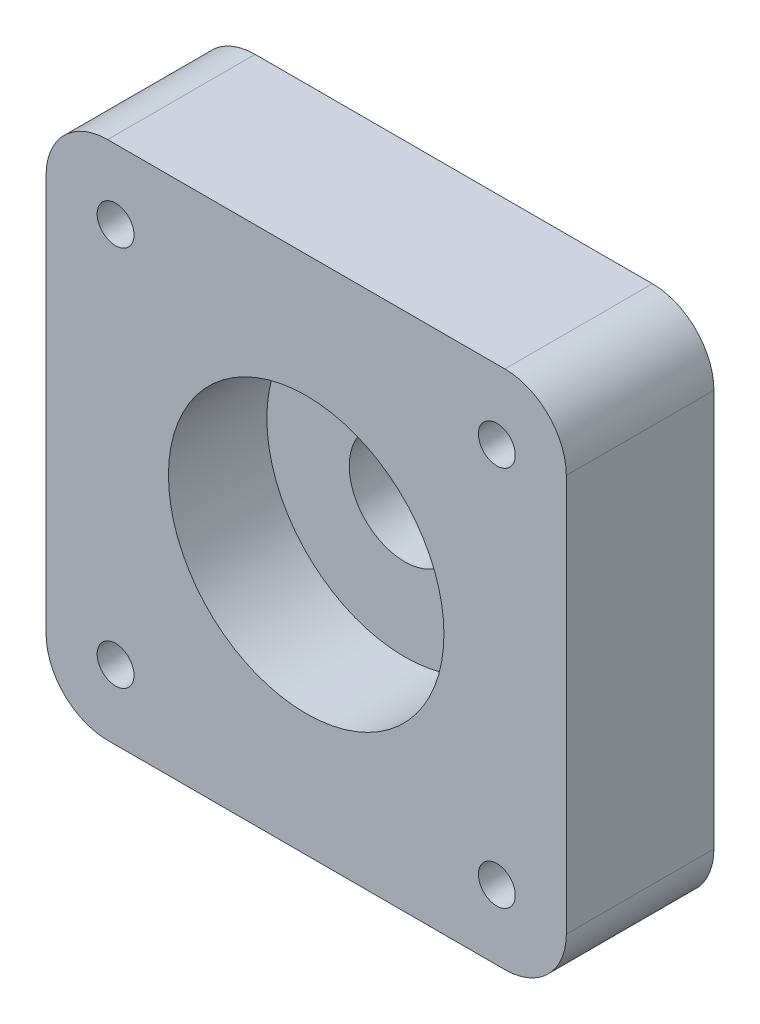
ISO-10303-21;
HEADER;
FILE_DESCRIPTION(('STEP AP214'),'2;1');
FILE_NAME('part.step','',(''),(''),'','','');
FILE_SCHEMA(('AUTOMOTIVE_DESIGN { 1 0 10303 214 1 1 1 1 }'));
ENDSEC;
DATA;
#1=APPLICATION_CONTEXT('core data for automotive mechanical design processes');
#2=APPLICATION_PROTOCOL_DEFINITION('international standard','automotive_design',2000,#1);
#3=PRODUCT_CONTEXT('',#1,'mechanical');
#4=PRODUCT('Part','Part','',(#3));
#5=PRODUCT_RELATED_PRODUCT_CATEGORY('part','',(#4));
#6=PRODUCT_DEFINITION_FORMATION('','',#4);
#7=PRODUCT_DEFINITION_CONTEXT('part definition',#1,'design');
#8=PRODUCT_DEFINITION('design','',#6,#7);
#9=PRODUCT_DEFINITION_SHAPE('','',#8);
#10=(LENGTH_UNIT() NAMED_UNIT(*) SI_UNIT(.MILLI.,.METRE.));
#11=(NAMED_UNIT(*) PLANE_ANGLE_UNIT() SI_UNIT($,.RADIAN.));
#12=(NAMED_UNIT(*) SI_UNIT($,.STERADIAN.) SOLID_ANGLE_UNIT());
#13=UNCERTAINTY_MEASURE_WITH_UNIT(LENGTH_MEASURE(1.E-05),#10,'distance_accuracy_value','');
#14=(GEOMETRIC_REPRESENTATION_CONTEXT(3) GLOBAL_UNCERTAINTY_ASSIGNED_CONTEXT((#13)) GLOBAL_UNIT_ASSIGNED_CONTEXT((#10,
#11,#12)) REPRESENTATION_CONTEXT('',''));
#15=CARTESIAN_POINT('',(0.,0.,0.));
#16=DIRECTION('',(0.,0.,1.));
#17=DIRECTION('',(1.,0.,0.));
#18=AXIS2_PLACEMENT_3D('',#15,#16,#17);
#19=CARTESIAN_POINT('',(0.,0.,6.));
#20=DIRECTION('',(0.,0.,-1.));
#21=DIRECTION('',(-1.,0.,0.));
#22=AXIS2_PLACEMENT_3D('',#19,#20,#21);
#23=PLANE('',#22);
#24=CARTESIAN_POINT('',(0.,0.,6.));
#25=DIRECTION('',(0.,0.,1.));
#26=DIRECTION('',(1.,0.,0.));
#27=AXIS2_PLACEMENT_3D('',#24,#25,#26);
#28=CIRCLE('',#27,11.2);
#29=CARTESIAN_POINT('',(11.2,0.,6.));
#30=VERTEX_POINT('',#29);
#31=EDGE_CURVE('E204',#30,#30,#28,.T.);
#32=ORIENTED_EDGE('',*,*,#31,.F.);
#33=EDGE_LOOP('',(#32));
#34=FACE_BOUND('',#33,.T.);
#35=DIRECTION('',(-1.,0.,0.));
#36=VECTOR('',#35,1.);
#37=CARTESIAN_POINT('',(-21.15,21.15,6.));
#38=LINE('',#37,#36);
#39=CARTESIAN_POINT('',(16.15,21.15,6.));
#40=VERTEX_POINT('',#39);
#41=CARTESIAN_POINT('',(-16.15,21.15,6.));
#42=VERTEX_POINT('',#41);
#43=EDGE_CURVE('E170',#40,#42,#38,.T.);
#44=ORIENTED_EDGE('',*,*,#43,.T.);
#45=CARTESIAN_POINT('',(-16.15,16.15,6.));
#46=DIRECTION('',(0.,0.,-1.));
#47=DIRECTION('',(-1.,0.,0.));
#48=AXIS2_PLACEMENT_3D('',#45,#46,#47);
#49=CIRCLE('',#48,5.);
#50=CARTESIAN_POINT('',(-21.15,16.15,6.));
#51=VERTEX_POINT('',#50);
#52=EDGE_CURVE('E150',#42,#51,#49,.F.);
#53=ORIENTED_EDGE('',*,*,#52,.T.);
#54=DIRECTION('',(0.,-1.,0.));
#55=VECTOR('',#54,1.);
#56=CARTESIAN_POINT('',(-21.15,-21.15,6.));
#57=LINE('',#56,#55);
#58=CARTESIAN_POINT('',(-21.15,-16.15,6.));
#59=VERTEX_POINT('',#58);
#60=EDGE_CURVE('E120',#51,#59,#57,.T.);
#61=ORIENTED_EDGE('',*,*,#60,.T.);
#62=CARTESIAN_POINT('',(-16.15,-16.15,6.));
#63=DIRECTION('',(0.,0.,-1.));
#64=DIRECTION('',(-1.,0.,0.));
#65=AXIS2_PLACEMENT_3D('',#62,#63,#64);
#66=CIRCLE('',#65,5.);
#67=CARTESIAN_POINT('',(-16.15,-21.15,6.));
#68=VERTEX_POINT('',#67);
#69=EDGE_CURVE('E56',#59,#68,#66,.F.);
#70=ORIENTED_EDGE('',*,*,#69,.T.);
#71=DIRECTION('',(1.,0.,0.));
#72=VECTOR('',#71,1.);
#73=CARTESIAN_POINT('',(-21.15,-21.15,6.));
#74=LINE('',#73,#72);
#75=CARTESIAN_POINT('',(16.15,-21.15,6.));
#76=VERTEX_POINT('',#75);
#77=EDGE_CURVE('E136',#68,#76,#74,.T.);
#78=ORIENTED_EDGE('',*,*,#77,.T.);
#79=CARTESIAN_POINT('',(16.15,-16.15,6.));
#80=DIRECTION('',(0.,0.,-1.));
#81=DIRECTION('',(-1.,0.,0.));
#82=AXIS2_PLACEMENT_3D('',#79,#80,#81);
#83=CIRCLE('',#82,5.);
#84=CARTESIAN_POINT('',(21.15,-16.15,6.));
#85=VERTEX_POINT('',#84);
#86=EDGE_CURVE('E147',#76,#85,#83,.F.);
#87=ORIENTED_EDGE('',*,*,#86,.T.);
#88=DIRECTION('',(0.,1.,0.));
#89=VECTOR('',#88,1.);
#90=CARTESIAN_POINT('',(21.15,-21.15,6.));
#91=LINE('',#90,#89);
#92=CARTESIAN_POINT('',(21.15,16.15,6.));
#93=VERTEX_POINT('',#92);
#94=EDGE_CURVE('E130',#85,#93,#91,.T.);
#95=ORIENTED_EDGE('',*,*,#94,.T.);
#96=CARTESIAN_POINT('',(16.15,16.15,6.));
#97=DIRECTION('',(0.,0.,-1.));
#98=DIRECTION('',(-1.,0.,0.));
#99=AXIS2_PLACEMENT_3D('',#96,#97,#98);
#100=CIRCLE('',#99,5.);
#101=EDGE_CURVE('E145',#93,#40,#100,.F.);
#102=ORIENTED_EDGE('',*,*,#101,.T.);
#103=EDGE_LOOP('',(#44,#53,#61,#70,#78,#87,#95,#102));
#104=FACE_BOUND('',#103,.T.);
#105=CARTESIAN_POINT('',(-15.5,15.5,6.));
#106=DIRECTION('',(0.,0.,1.));
#107=DIRECTION('',(1.,0.,0.));
#108=AXIS2_PLACEMENT_3D('',#105,#106,#107);
#109=CIRCLE('',#108,1.5);
#110=CARTESIAN_POINT('',(-14.,15.5,6.));
#111=VERTEX_POINT('',#110);
#112=EDGE_CURVE('E175',#111,#111,#109,.T.);
#113=ORIENTED_EDGE('',*,*,#112,.F.);
#114=EDGE_LOOP('',(#113));
#115=FACE_BOUND('',#114,.T.);
#116=CARTESIAN_POINT('',(-15.5,-15.5,6.));
#117=DIRECTION('',(0.,0.,1.));
#118=DIRECTION('',(1.,0.,0.));
#119=AXIS2_PLACEMENT_3D('',#116,#117,#118);
#120=CIRCLE('',#119,1.5);
#121=CARTESIAN_POINT('',(-14.,-15.5,6.));
#122=VERTEX_POINT('',#121);
#123=EDGE_CURVE('E184',#122,#122,#120,.T.);
#124=ORIENTED_EDGE('',*,*,#123,.F.);
#125=EDGE_LOOP('',(#124));
#126=FACE_BOUND('',#125,.T.);
#127=CARTESIAN_POINT('',(15.5,-15.5,6.));
#128=DIRECTION('',(0.,0.,1.));
#129=DIRECTION('',(-1.,0.,0.));
#130=AXIS2_PLACEMENT_3D('',#127,#128,#129);
#131=CIRCLE('',#130,1.5);
#132=CARTESIAN_POINT('',(14.,-15.5,6.));
#133=VERTEX_POINT('',#132);
#134=EDGE_CURVE('E189',#133,#133,#131,.T.);
#135=ORIENTED_EDGE('',*,*,#134,.F.);
#136=EDGE_LOOP('',(#135));
#137=FACE_BOUND('',#136,.T.);
#138=CARTESIAN_POINT('',(15.5,15.5,6.));
#139=DIRECTION('',(0.,0.,1.));
#140=DIRECTION('',(-1.,0.,0.));
#141=AXIS2_PLACEMENT_3D('',#138,#139,#140);
#142=CIRCLE('',#141,1.5);
#143=CARTESIAN_POINT('',(14.,15.5,6.));
#144=VERTEX_POINT('',#143);
#145=EDGE_CURVE('E195',#144,#144,#142,.T.);
#146=ORIENTED_EDGE('',*,*,#145,.F.);
#147=EDGE_LOOP('',(#146));
#148=FACE_BOUND('',#147,.T.);
#149=ADVANCED_FACE('F33',(#34,#104,#115,#126,#137,#148),#23,.F.);
#150=CARTESIAN_POINT('',(0.,0.,-6.));
#151=DIRECTION('',(0.,0.,-1.));
#152=DIRECTION('',(-1.,0.,0.));
#153=AXIS2_PLACEMENT_3D('',#150,#151,#152);
#154=PLANE('',#153);
#155=CARTESIAN_POINT('',(0.,0.,-6.));
#156=DIRECTION('',(0.,0.,-1.));
#157=DIRECTION('',(-1.,0.,0.));
#158=AXIS2_PLACEMENT_3D('',#155,#156,#157);
#159=CIRCLE('',#158,4.5);
#160=CARTESIAN_POINT('',(-4.5,0.,-6.));
#161=VERTEX_POINT('',#160);
#162=EDGE_CURVE('E209',#161,#161,#159,.T.);
#163=ORIENTED_EDGE('',*,*,#162,.F.);
#164=EDGE_LOOP('',(#163));
#165=FACE_BOUND('',#164,.T.);
#166=CARTESIAN_POINT('',(15.5,-15.5,-6.));
#167=DIRECTION('',(0.,0.,1.));
#168=DIRECTION('',(-1.,0.,0.));
#169=AXIS2_PLACEMENT_3D('',#166,#167,#168);
#170=CIRCLE('',#169,1.5);
#171=CARTESIAN_POINT('',(14.,-15.5,-6.));
#172=VERTEX_POINT('',#171);
#173=EDGE_CURVE('E192',#172,#172,#170,.T.);
#174=ORIENTED_EDGE('',*,*,#173,.T.);
#175=EDGE_LOOP('',(#174));
#176=FACE_BOUND('',#175,.T.);
#177=CARTESIAN_POINT('',(-15.5,15.5,-6.));
#178=DIRECTION('',(0.,0.,1.));
#179=DIRECTION('',(1.,0.,0.));
#180=AXIS2_PLACEMENT_3D('',#177,#178,#179);
#181=CIRCLE('',#180,1.5);
#182=CARTESIAN_POINT('',(-14.,15.5,-6.));
#183=VERTEX_POINT('',#182);
#184=EDGE_CURVE('E177',#183,#183,#181,.T.);
#185=ORIENTED_EDGE('',*,*,#184,.T.);
#186=EDGE_LOOP('',(#185));
#187=FACE_BOUND('',#186,.T.);
#188=DIRECTION('',(0.,-1.,0.));
#189=VECTOR('',#188,1.);
#190=CARTESIAN_POINT('',(-21.15,-21.15,-6.));
#191=LINE('',#190,#189);
#192=CARTESIAN_POINT('',(-21.15,16.15,-6.));
#193=VERTEX_POINT('',#192);
#194=CARTESIAN_POINT('',(-21.15,-16.15,-6.));
#195=VERTEX_POINT('',#194);
#196=EDGE_CURVE('E118',#193,#195,#191,.T.);
#197=ORIENTED_EDGE('',*,*,#196,.F.);
#198=CARTESIAN_POINT('',(-16.15,16.15,-6.));
#199=DIRECTION('',(0.,0.,-1.));
#200=DIRECTION('',(-1.,0.,0.));
#201=AXIS2_PLACEMENT_3D('',#198,#199,#200);
#202=CIRCLE('',#201,5.);
#203=CARTESIAN_POINT('',(-16.15,21.15,-6.));
#204=VERTEX_POINT('',#203);
#205=EDGE_CURVE('E101',#193,#204,#202,.T.);
#206=ORIENTED_EDGE('',*,*,#205,.T.);
#207=DIRECTION('',(-1.,0.,0.));
#208=VECTOR('',#207,1.);
#209=CARTESIAN_POINT('',(-21.15,21.15,-6.));
#210=LINE('',#209,#208);
#211=CARTESIAN_POINT('',(16.15,21.15,-6.));
#212=VERTEX_POINT('',#211);
#213=EDGE_CURVE('E128',#212,#204,#210,.T.);
#214=ORIENTED_EDGE('',*,*,#213,.F.);
#215=CARTESIAN_POINT('',(16.15,16.15,-6.));
#216=DIRECTION('',(0.,0.,-1.));
#217=DIRECTION('',(-1.,0.,0.));
#218=AXIS2_PLACEMENT_3D('',#215,#216,#217);
#219=CIRCLE('',#218,5.);
#220=CARTESIAN_POINT('',(21.15,16.15,-6.));
#221=VERTEX_POINT('',#220);
#222=EDGE_CURVE('E121',#212,#221,#219,.T.);
#223=ORIENTED_EDGE('',*,*,#222,.T.);
#224=DIRECTION('',(0.,1.,0.));
#225=VECTOR('',#224,1.);
#226=CARTESIAN_POINT('',(21.15,-21.15,-6.));
#227=LINE('',#226,#225);
#228=CARTESIAN_POINT('',(21.15,-16.15,-6.));
#229=VERTEX_POINT('',#228);
#230=EDGE_CURVE('E132',#229,#221,#227,.T.);
#231=ORIENTED_EDGE('',*,*,#230,.F.);
#232=CARTESIAN_POINT('',(16.15,-16.15,-6.));
#233=DIRECTION('',(0.,0.,-1.));
#234=DIRECTION('',(-1.,0.,0.));
#235=AXIS2_PLACEMENT_3D('',#232,#233,#234);
#236=CIRCLE('',#235,5.);
#237=CARTESIAN_POINT('',(16.15,-21.15,-6.));
#238=VERTEX_POINT('',#237);
#239=EDGE_CURVE('E139',#229,#238,#236,.T.);
#240=ORIENTED_EDGE('',*,*,#239,.T.);
#241=DIRECTION('',(1.,0.,0.));
#242=VECTOR('',#241,1.);
#243=CARTESIAN_POINT('',(-21.15,-21.15,-6.));
#244=LINE('',#243,#242);
#245=CARTESIAN_POINT('',(-16.15,-21.15,-6.));
#246=VERTEX_POINT('',#245);
#247=EDGE_CURVE('E127',#246,#238,#244,.T.);
#248=ORIENTED_EDGE('',*,*,#247,.F.);
#249=CARTESIAN_POINT('',(-16.15,-16.15,-6.));
#250=DIRECTION('',(0.,0.,-1.));
#251=DIRECTION('',(-1.,0.,0.));
#252=AXIS2_PLACEMENT_3D('',#249,#250,#251);
#253=CIRCLE('',#252,5.);
#254=EDGE_CURVE('E112',#246,#195,#253,.T.);
#255=ORIENTED_EDGE('',*,*,#254,.T.);
#256=EDGE_LOOP('',(#197,#206,#214,#223,#231,#240,#248,#255));
#257=FACE_BOUND('',#256,.T.);
#258=CARTESIAN_POINT('',(-15.5,-15.5,-6.));
#259=DIRECTION('',(0.,0.,1.));
#260=DIRECTION('',(1.,0.,0.));
#261=AXIS2_PLACEMENT_3D('',#258,#259,#260);
#262=CIRCLE('',#261,1.5);
#263=CARTESIAN_POINT('',(-14.,-15.5,-6.));
#264=VERTEX_POINT('',#263);
#265=EDGE_CURVE('E186',#264,#264,#262,.T.);
#266=ORIENTED_EDGE('',*,*,#265,.T.);
#267=EDGE_LOOP('',(#266));
#268=FACE_BOUND('',#267,.T.);
#269=CARTESIAN_POINT('',(15.5,15.5,-6.));
#270=DIRECTION('',(0.,0.,1.));
#271=DIRECTION('',(-1.,0.,0.));
#272=AXIS2_PLACEMENT_3D('',#269,#270,#271);
#273=CIRCLE('',#272,1.5);
#274=CARTESIAN_POINT('',(14.,15.5,-6.));
#275=VERTEX_POINT('',#274);
#276=EDGE_CURVE('E198',#275,#275,#273,.T.);
#277=ORIENTED_EDGE('',*,*,#276,.T.);
#278=EDGE_LOOP('',(#277));
#279=FACE_BOUND('',#278,.T.);
#280=ADVANCED_FACE('F124',(#165,#176,#187,#257,#268,#279),#154,.T.);
#281=CARTESIAN_POINT('',(21.15,-21.15,6.));
#282=DIRECTION('',(-1.,0.,0.));
#283=DIRECTION('',(0.,0.,1.));
#284=AXIS2_PLACEMENT_3D('',#281,#282,#283);
#285=PLANE('',#284);
#286=ORIENTED_EDGE('',*,*,#94,.F.);
#287=DIRECTION('',(0.,0.,-1.));
#288=VECTOR('',#287,1.);
#289=CARTESIAN_POINT('',(21.15,-16.15,6.));
#290=LINE('',#289,#288);
#291=EDGE_CURVE('E11',#85,#229,#290,.T.);
#292=ORIENTED_EDGE('',*,*,#291,.T.);
#293=ORIENTED_EDGE('',*,*,#230,.T.);
#294=DIRECTION('',(0.,0.,-1.));
#295=VECTOR('',#294,1.);
#296=CARTESIAN_POINT('',(21.15,16.15,6.));
#297=LINE('',#296,#295);
#298=EDGE_CURVE('E42',#221,#93,#297,.F.);
#299=ORIENTED_EDGE('',*,*,#298,.T.);
#300=EDGE_LOOP('',(#286,#292,#293,#299));
#301=FACE_BOUND('',#300,.T.);
#302=ADVANCED_FACE('F161',(#301),#285,.F.);
#303=CARTESIAN_POINT('',(-21.15,21.15,6.));
#304=DIRECTION('',(0.,-1.,0.));
#305=DIRECTION('',(0.,0.,-1.));
#306=AXIS2_PLACEMENT_3D('',#303,#304,#305);
#307=PLANE('',#306);
#308=ORIENTED_EDGE('',*,*,#213,.T.);
#309=DIRECTION('',(0.,0.,-1.));
#310=VECTOR('',#309,1.);
#311=CARTESIAN_POINT('',(-16.15,21.15,6.));
#312=LINE('',#311,#310);
#313=EDGE_CURVE('E106',#204,#42,#312,.F.);
#314=ORIENTED_EDGE('',*,*,#313,.T.);
#315=ORIENTED_EDGE('',*,*,#43,.F.);
#316=DIRECTION('',(0.,0.,-1.));
#317=VECTOR('',#316,1.);
#318=CARTESIAN_POINT('',(16.15,21.15,6.));
#319=LINE('',#318,#317);
#320=EDGE_CURVE('E111',#40,#212,#319,.T.);
#321=ORIENTED_EDGE('',*,*,#320,.T.);
#322=EDGE_LOOP('',(#308,#314,#315,#321));
#323=FACE_BOUND('',#322,.T.);
#324=ADVANCED_FACE('F174',(#323),#307,.F.);
#325=CARTESIAN_POINT('',(-21.15,-21.15,6.));
#326=DIRECTION('',(1.,0.,0.));
#327=DIRECTION('',(0.,0.,-1.));
#328=AXIS2_PLACEMENT_3D('',#325,#326,#327);
#329=PLANE('',#328);
#330=ORIENTED_EDGE('',*,*,#60,.F.);
#331=DIRECTION('',(0.,0.,-1.));
#332=VECTOR('',#331,1.);
#333=CARTESIAN_POINT('',(-21.15,16.15,6.));
#334=LINE('',#333,#332);
#335=EDGE_CURVE('E105',#51,#193,#334,.T.);
#336=ORIENTED_EDGE('',*,*,#335,.T.);
#337=ORIENTED_EDGE('',*,*,#196,.T.);
#338=DIRECTION('',(0.,0.,-1.));
#339=VECTOR('',#338,1.);
#340=CARTESIAN_POINT('',(-21.15,-16.15,6.));
#341=LINE('',#340,#339);
#342=EDGE_CURVE('E122',#195,#59,#341,.F.);
#343=ORIENTED_EDGE('',*,*,#342,.T.);
#344=EDGE_LOOP('',(#330,#336,#337,#343));
#345=FACE_BOUND('',#344,.T.);
#346=ADVANCED_FACE('F117',(#345),#329,.F.);
#347=CARTESIAN_POINT('',(-21.15,-21.15,6.));
#348=DIRECTION('',(0.,1.,0.));
#349=DIRECTION('',(0.,0.,1.));
#350=AXIS2_PLACEMENT_3D('',#347,#348,#349);
#351=PLANE('',#350);
#352=ORIENTED_EDGE('',*,*,#77,.F.);
#353=DIRECTION('',(0.,0.,-1.));
#354=VECTOR('',#353,1.);
#355=CARTESIAN_POINT('',(-16.15,-21.15,6.));
#356=LINE('',#355,#354);
#357=EDGE_CURVE('E153',#68,#246,#356,.T.);
#358=ORIENTED_EDGE('',*,*,#357,.T.);
#359=ORIENTED_EDGE('',*,*,#247,.T.);
#360=DIRECTION('',(0.,0.,-1.));
#361=VECTOR('',#360,1.);
#362=CARTESIAN_POINT('',(16.15,-21.15,6.));
#363=LINE('',#362,#361);
#364=EDGE_CURVE('E49',#238,#76,#363,.F.);
#365=ORIENTED_EDGE('',*,*,#364,.T.);
#366=EDGE_LOOP('',(#352,#358,#359,#365));
#367=FACE_BOUND('',#366,.T.);
#368=ADVANCED_FACE('F241',(#367),#351,.F.);
#369=CARTESIAN_POINT('',(-15.5,15.5,6.));
#370=DIRECTION('',(0.,0.,-1.));
#371=DIRECTION('',(-1.,0.,0.));
#372=AXIS2_PLACEMENT_3D('',#369,#370,#371);
#373=CYLINDRICAL_SURFACE('',#372,1.5);
#374=ORIENTED_EDGE('',*,*,#112,.T.);
#375=EDGE_LOOP('',(#374));
#376=FACE_BOUND('',#375,.T.);
#377=ORIENTED_EDGE('',*,*,#184,.F.);
#378=EDGE_LOOP('',(#377));
#379=FACE_BOUND('',#378,.T.);
#380=ADVANCED_FACE('F238',(#376,#379),#373,.F.);
#381=CARTESIAN_POINT('',(-15.5,-15.5,6.));
#382=DIRECTION('',(0.,0.,-1.));
#383=DIRECTION('',(-1.,0.,0.));
#384=AXIS2_PLACEMENT_3D('',#381,#382,#383);
#385=CYLINDRICAL_SURFACE('',#384,1.5);
#386=ORIENTED_EDGE('',*,*,#123,.T.);
#387=EDGE_LOOP('',(#386));
#388=FACE_BOUND('',#387,.T.);
#389=ORIENTED_EDGE('',*,*,#265,.F.);
#390=EDGE_LOOP('',(#389));
#391=FACE_BOUND('',#390,.T.);
#392=ADVANCED_FACE('F320',(#388,#391),#385,.F.);
#393=CARTESIAN_POINT('',(15.5,-15.5,6.));
#394=DIRECTION('',(0.,0.,-1.));
#395=DIRECTION('',(-1.,0.,0.));
#396=AXIS2_PLACEMENT_3D('',#393,#394,#395);
#397=CYLINDRICAL_SURFACE('',#396,1.5);
#398=ORIENTED_EDGE('',*,*,#134,.T.);
#399=EDGE_LOOP('',(#398));
#400=FACE_BOUND('',#399,.T.);
#401=ORIENTED_EDGE('',*,*,#173,.F.);
#402=EDGE_LOOP('',(#401));
#403=FACE_BOUND('',#402,.T.);
#404=ADVANCED_FACE('F310',(#400,#403),#397,.F.);
#405=CARTESIAN_POINT('',(15.5,15.5,6.));
#406=DIRECTION('',(0.,0.,-1.));
#407=DIRECTION('',(-1.,0.,0.));
#408=AXIS2_PLACEMENT_3D('',#405,#406,#407);
#409=CYLINDRICAL_SURFACE('',#408,1.5);
#410=ORIENTED_EDGE('',*,*,#145,.T.);
#411=EDGE_LOOP('',(#410));
#412=FACE_BOUND('',#411,.T.);
#413=ORIENTED_EDGE('',*,*,#276,.F.);
#414=EDGE_LOOP('',(#413));
#415=FACE_BOUND('',#414,.T.);
#416=ADVANCED_FACE('F253',(#412,#415),#409,.F.);
#417=CARTESIAN_POINT('',(-16.15,16.15,6.));
#418=DIRECTION('',(0.,0.,-1.));
#419=DIRECTION('',(-1.,0.,0.));
#420=AXIS2_PLACEMENT_3D('',#417,#418,#419);
#421=CYLINDRICAL_SURFACE('',#420,5.);
#422=ORIENTED_EDGE('',*,*,#52,.F.);
#423=ORIENTED_EDGE('',*,*,#313,.F.);
#424=ORIENTED_EDGE('',*,*,#205,.F.);
#425=ORIENTED_EDGE('',*,*,#335,.F.);
#426=EDGE_LOOP('',(#422,#423,#424,#425));
#427=FACE_BOUND('',#426,.T.);
#428=ADVANCED_FACE('F104',(#427),#421,.T.);
#429=CARTESIAN_POINT('',(-16.15,-16.15,6.));
#430=DIRECTION('',(0.,0.,-1.));
#431=DIRECTION('',(-1.,0.,0.));
#432=AXIS2_PLACEMENT_3D('',#429,#430,#431);
#433=CYLINDRICAL_SURFACE('',#432,5.);
#434=ORIENTED_EDGE('',*,*,#69,.F.);
#435=ORIENTED_EDGE('',*,*,#342,.F.);
#436=ORIENTED_EDGE('',*,*,#254,.F.);
#437=ORIENTED_EDGE('',*,*,#357,.F.);
#438=EDGE_LOOP('',(#434,#435,#436,#437));
#439=FACE_BOUND('',#438,.T.);
#440=ADVANCED_FACE('F252',(#439),#433,.T.);
#441=CARTESIAN_POINT('',(16.15,-16.15,6.));
#442=DIRECTION('',(0.,0.,-1.));
#443=DIRECTION('',(-1.,0.,0.));
#444=AXIS2_PLACEMENT_3D('',#441,#442,#443);
#445=CYLINDRICAL_SURFACE('',#444,5.);
#446=ORIENTED_EDGE('',*,*,#86,.F.);
#447=ORIENTED_EDGE('',*,*,#364,.F.);
#448=ORIENTED_EDGE('',*,*,#239,.F.);
#449=ORIENTED_EDGE('',*,*,#291,.F.);
#450=EDGE_LOOP('',(#446,#447,#448,#449));
#451=FACE_BOUND('',#450,.T.);
#452=ADVANCED_FACE('F255',(#451),#445,.T.);
#453=CARTESIAN_POINT('',(16.15,16.15,6.));
#454=DIRECTION('',(0.,0.,-1.));
#455=DIRECTION('',(-1.,0.,0.));
#456=AXIS2_PLACEMENT_3D('',#453,#454,#455);
#457=CYLINDRICAL_SURFACE('',#456,5.);
#458=ORIENTED_EDGE('',*,*,#101,.F.);
#459=ORIENTED_EDGE('',*,*,#298,.F.);
#460=ORIENTED_EDGE('',*,*,#222,.F.);
#461=ORIENTED_EDGE('',*,*,#320,.F.);
#462=EDGE_LOOP('',(#458,#459,#460,#461));
#463=FACE_BOUND('',#462,.T.);
#464=ADVANCED_FACE('F35',(#463),#457,.T.);
#465=CARTESIAN_POINT('',(0.,0.,-2.));
#466=DIRECTION('',(0.,0.,1.));
#467=DIRECTION('',(1.,0.,0.));
#468=AXIS2_PLACEMENT_3D('',#465,#466,#467);
#469=CYLINDRICAL_SURFACE('',#468,11.2);
#470=CARTESIAN_POINT('',(0.,0.,-2.));
#471=DIRECTION('',(0.,0.,1.));
#472=DIRECTION('',(1.,0.,0.));
#473=AXIS2_PLACEMENT_3D('',#470,#471,#472);
#474=CIRCLE('',#473,11.2);
#475=CARTESIAN_POINT('',(11.2,0.,-2.));
#476=VERTEX_POINT('',#475);
#477=EDGE_CURVE('E201',#476,#476,#474,.T.);
#478=ORIENTED_EDGE('',*,*,#477,.F.);
#479=EDGE_LOOP('',(#478));
#480=FACE_BOUND('',#479,.T.);
#481=ORIENTED_EDGE('',*,*,#31,.T.);
#482=EDGE_LOOP('',(#481));
#483=FACE_BOUND('',#482,.T.);
#484=ADVANCED_FACE('F221',(#480,#483),#469,.F.);
#485=CARTESIAN_POINT('',(0.,0.,-2.));
#486=DIRECTION('',(0.,0.,1.));
#487=DIRECTION('',(1.,0.,0.));
#488=AXIS2_PLACEMENT_3D('',#485,#486,#487);
#489=PLANE('',#488);
#490=CARTESIAN_POINT('',(0.,0.,-2.));
#491=DIRECTION('',(0.,0.,1.));
#492=DIRECTION('',(1.,0.,0.));
#493=AXIS2_PLACEMENT_3D('',#490,#491,#492);
#494=CIRCLE('',#493,4.5);
#495=CARTESIAN_POINT('',(4.5,0.,-2.));
#496=VERTEX_POINT('',#495);
#497=EDGE_CURVE('E37',#496,#496,#494,.T.);
#498=ORIENTED_EDGE('',*,*,#497,.F.);
#499=EDGE_LOOP('',(#498));
#500=FACE_BOUND('',#499,.T.);
#501=ORIENTED_EDGE('',*,*,#477,.T.);
#502=EDGE_LOOP('',(#501));
#503=FACE_BOUND('',#502,.T.);
#504=ADVANCED_FACE('F218',(#500,#503),#489,.T.);
#505=CARTESIAN_POINT('',(0.,0.,4.));
#506=DIRECTION('',(0.,0.,-1.));
#507=DIRECTION('',(-1.,0.,0.));
#508=AXIS2_PLACEMENT_3D('',#505,#506,#507);
#509=CYLINDRICAL_SURFACE('',#508,4.5);
#510=ORIENTED_EDGE('',*,*,#497,.T.);
#511=EDGE_LOOP('',(#510));
#512=FACE_BOUND('',#511,.T.);
#513=ORIENTED_EDGE('',*,*,#162,.T.);
#514=EDGE_LOOP('',(#513));
#515=FACE_BOUND('',#514,.T.);
#516=ADVANCED_FACE('F216',(#512,#515),#509,.F.);
#517=CLOSED_SHELL('',(#149,#280,#302,#324,#346,#368,#380,#392,#404,#416,#428,#440,#452,#464,
#484,#504,#516));
#518=MANIFOLD_SOLID_BREP('B2',#517);
#519=ADVANCED_BREP_SHAPE_REPRESENTATION('',(#18,#518),#14);
#520=SHAPE_DEFINITION_REPRESENTATION(#9,#519);
ENDSEC;
END-ISO-10303-21;
